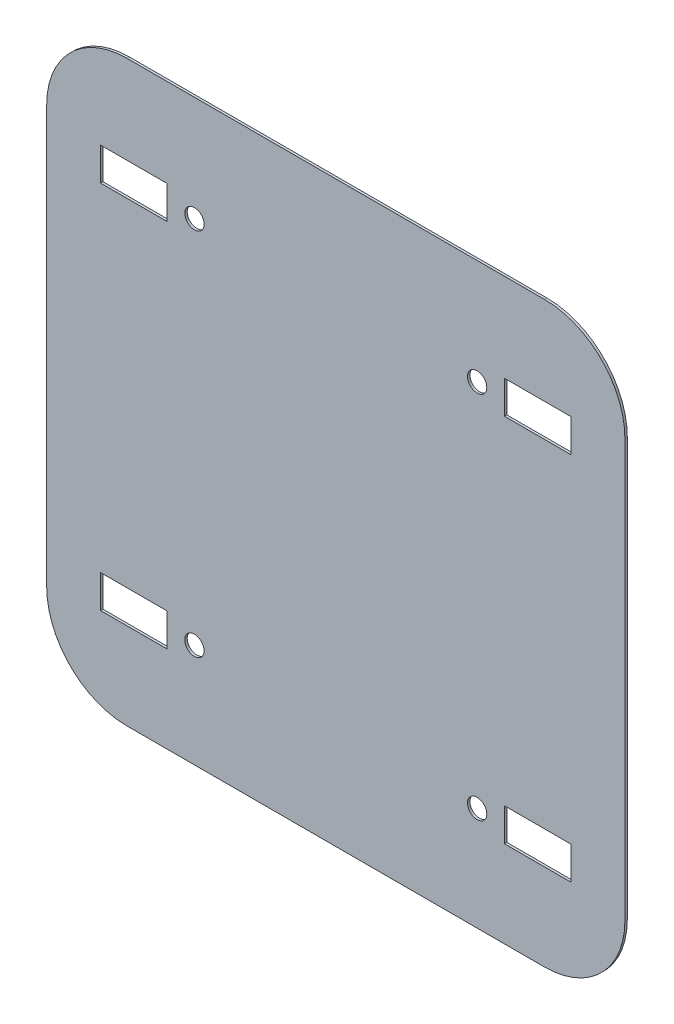
ISO-10303-21;
HEADER;
FILE_DESCRIPTION(('STEP AP214'),'2;1');
FILE_NAME('part.step','',(''),(''),'','','');
FILE_SCHEMA(('AUTOMOTIVE_DESIGN { 1 0 10303 214 1 1 1 1 }'));
ENDSEC;
DATA;
#1=APPLICATION_CONTEXT('core data for automotive mechanical design processes');
#2=APPLICATION_PROTOCOL_DEFINITION('international standard','automotive_design',2000,#1);
#3=PRODUCT_CONTEXT('',#1,'mechanical');
#4=PRODUCT('Part','Part','',(#3));
#5=PRODUCT_RELATED_PRODUCT_CATEGORY('part','',(#4));
#6=PRODUCT_DEFINITION_FORMATION('','',#4);
#7=PRODUCT_DEFINITION_CONTEXT('part definition',#1,'design');
#8=PRODUCT_DEFINITION('design','',#6,#7);
#9=PRODUCT_DEFINITION_SHAPE('','',#8);
#10=(LENGTH_UNIT() NAMED_UNIT(*) SI_UNIT(.MILLI.,.METRE.));
#11=(NAMED_UNIT(*) PLANE_ANGLE_UNIT() SI_UNIT($,.RADIAN.));
#12=(NAMED_UNIT(*) SI_UNIT($,.STERADIAN.) SOLID_ANGLE_UNIT());
#13=UNCERTAINTY_MEASURE_WITH_UNIT(LENGTH_MEASURE(1.E-05),#10,'distance_accuracy_value','');
#14=(GEOMETRIC_REPRESENTATION_CONTEXT(3) GLOBAL_UNCERTAINTY_ASSIGNED_CONTEXT((#13)) GLOBAL_UNIT_ASSIGNED_CONTEXT((#10,
#11,#12)) REPRESENTATION_CONTEXT('',''));
#15=CARTESIAN_POINT('',(0.,0.,0.));
#16=DIRECTION('',(0.,0.,1.));
#17=DIRECTION('',(1.,0.,0.));
#18=AXIS2_PLACEMENT_3D('',#15,#16,#17);
#19=CARTESIAN_POINT('',(50.,50.,1.5));
#20=DIRECTION('',(0.,0.,-1.));
#21=DIRECTION('',(-1.,0.,0.));
#22=AXIS2_PLACEMENT_3D('',#19,#20,#21);
#23=CYLINDRICAL_SURFACE('',#22,50.);
#24=CARTESIAN_POINT('',(50.,50.,0.));
#25=DIRECTION('',(0.,0.,1.));
#26=DIRECTION('',(1.,0.,0.));
#27=AXIS2_PLACEMENT_3D('',#24,#25,#26);
#28=CIRCLE('',#27,50.);
#29=CARTESIAN_POINT('',(0.,50.0000000000003,0.));
#30=VERTEX_POINT('',#29);
#31=CARTESIAN_POINT('',(50.0000000000003,0.,0.));
#32=VERTEX_POINT('',#31);
#33=EDGE_CURVE('E326',#30,#32,#28,.T.);
#34=ORIENTED_EDGE('',*,*,#33,.T.);
#35=DIRECTION('',(0.,0.,-1.));
#36=VECTOR('',#35,1.);
#37=CARTESIAN_POINT('',(50.0000000000003,0.,1.5));
#38=LINE('',#37,#36);
#39=CARTESIAN_POINT('',(50.0000000000003,0.,1.5));
#40=VERTEX_POINT('',#39);
#41=EDGE_CURVE('E11',#40,#32,#38,.T.);
#42=ORIENTED_EDGE('',*,*,#41,.F.);
#43=CARTESIAN_POINT('',(50.,50.,1.5));
#44=DIRECTION('',(0.,0.,1.));
#45=DIRECTION('',(1.,0.,0.));
#46=AXIS2_PLACEMENT_3D('',#43,#44,#45);
#47=CIRCLE('',#46,50.);
#48=CARTESIAN_POINT('',(0.,50.0000000000003,1.5));
#49=VERTEX_POINT('',#48);
#50=EDGE_CURVE('E333',#49,#40,#47,.T.);
#51=ORIENTED_EDGE('',*,*,#50,.F.);
#52=DIRECTION('',(0.,0.,-1.));
#53=VECTOR('',#52,1.);
#54=CARTESIAN_POINT('',(0.,50.0000000000003,1.5));
#55=LINE('',#54,#53);
#56=EDGE_CURVE('E351',#49,#30,#55,.T.);
#57=ORIENTED_EDGE('',*,*,#56,.T.);
#58=EDGE_LOOP('',(#34,#42,#51,#57));
#59=FACE_BOUND('',#58,.T.);
#60=ADVANCED_FACE('F34',(#59),#23,.T.);
#61=CARTESIAN_POINT('',(50.0000000000003,0.,1.5));
#62=DIRECTION('',(0.,1.,0.));
#63=DIRECTION('',(0.,0.,1.));
#64=AXIS2_PLACEMENT_3D('',#61,#62,#63);
#65=PLANE('',#64);
#66=DIRECTION('',(1.,0.,0.));
#67=VECTOR('',#66,1.);
#68=CARTESIAN_POINT('',(50.0000000000003,0.,0.));
#69=LINE('',#68,#67);
#70=CARTESIAN_POINT('',(310.,0.,0.));
#71=VERTEX_POINT('',#70);
#72=EDGE_CURVE('E354',#32,#71,#69,.T.);
#73=ORIENTED_EDGE('',*,*,#72,.T.);
#74=DIRECTION('',(0.,0.,-1.));
#75=VECTOR('',#74,1.);
#76=CARTESIAN_POINT('',(310.,0.,1.5));
#77=LINE('',#76,#75);
#78=CARTESIAN_POINT('',(310.,0.,1.5));
#79=VERTEX_POINT('',#78);
#80=EDGE_CURVE('E41',#79,#71,#77,.T.);
#81=ORIENTED_EDGE('',*,*,#80,.F.);
#82=DIRECTION('',(1.,0.,0.));
#83=VECTOR('',#82,1.);
#84=CARTESIAN_POINT('',(50.0000000000003,0.,1.5));
#85=LINE('',#84,#83);
#86=EDGE_CURVE('E336',#40,#79,#85,.T.);
#87=ORIENTED_EDGE('',*,*,#86,.F.);
#88=ORIENTED_EDGE('',*,*,#41,.T.);
#89=EDGE_LOOP('',(#73,#81,#87,#88));
#90=FACE_BOUND('',#89,.T.);
#91=ADVANCED_FACE('F410',(#90),#65,.F.);
#92=CARTESIAN_POINT('',(310.,50.,1.5));
#93=DIRECTION('',(0.,0.,-1.));
#94=DIRECTION('',(-1.,0.,0.));
#95=AXIS2_PLACEMENT_3D('',#92,#93,#94);
#96=CYLINDRICAL_SURFACE('',#95,50.);
#97=CARTESIAN_POINT('',(310.,50.,0.));
#98=DIRECTION('',(0.,0.,1.));
#99=DIRECTION('',(-1.,0.,0.));
#100=AXIS2_PLACEMENT_3D('',#97,#98,#99);
#101=CIRCLE('',#100,50.);
#102=CARTESIAN_POINT('',(360.,50.0000000000003,0.));
#103=VERTEX_POINT('',#102);
#104=EDGE_CURVE('E356',#71,#103,#101,.T.);
#105=ORIENTED_EDGE('',*,*,#104,.T.);
#106=DIRECTION('',(0.,0.,-1.));
#107=VECTOR('',#106,1.);
#108=CARTESIAN_POINT('',(360.,50.0000000000003,1.5));
#109=LINE('',#108,#107);
#110=CARTESIAN_POINT('',(360.,50.0000000000003,1.5));
#111=VERTEX_POINT('',#110);
#112=EDGE_CURVE('E381',#111,#103,#109,.T.);
#113=ORIENTED_EDGE('',*,*,#112,.F.);
#114=CARTESIAN_POINT('',(310.,50.,1.5));
#115=DIRECTION('',(0.,0.,1.));
#116=DIRECTION('',(-1.,0.,0.));
#117=AXIS2_PLACEMENT_3D('',#114,#115,#116);
#118=CIRCLE('',#117,50.);
#119=EDGE_CURVE('E339',#79,#111,#118,.T.);
#120=ORIENTED_EDGE('',*,*,#119,.F.);
#121=ORIENTED_EDGE('',*,*,#80,.T.);
#122=EDGE_LOOP('',(#105,#113,#120,#121));
#123=FACE_BOUND('',#122,.T.);
#124=ADVANCED_FACE('F388',(#123),#96,.T.);
#125=CARTESIAN_POINT('',(360.,50.0000000000003,1.5));
#126=DIRECTION('',(-1.,0.,0.));
#127=DIRECTION('',(0.,0.,1.));
#128=AXIS2_PLACEMENT_3D('',#125,#126,#127);
#129=PLANE('',#128);
#130=DIRECTION('',(0.,1.,0.));
#131=VECTOR('',#130,1.);
#132=CARTESIAN_POINT('',(360.,50.0000000000003,0.));
#133=LINE('',#132,#131);
#134=CARTESIAN_POINT('',(360.,310.,0.));
#135=VERTEX_POINT('',#134);
#136=EDGE_CURVE('E358',#103,#135,#133,.T.);
#137=ORIENTED_EDGE('',*,*,#136,.T.);
#138=DIRECTION('',(0.,0.,-1.));
#139=VECTOR('',#138,1.);
#140=CARTESIAN_POINT('',(360.,310.,1.5));
#141=LINE('',#140,#139);
#142=CARTESIAN_POINT('',(360.,310.,1.5));
#143=VERTEX_POINT('',#142);
#144=EDGE_CURVE('E378',#143,#135,#141,.T.);
#145=ORIENTED_EDGE('',*,*,#144,.F.);
#146=DIRECTION('',(0.,1.,0.));
#147=VECTOR('',#146,1.);
#148=CARTESIAN_POINT('',(360.,50.0000000000003,1.5));
#149=LINE('',#148,#147);
#150=EDGE_CURVE('E341',#111,#143,#149,.T.);
#151=ORIENTED_EDGE('',*,*,#150,.F.);
#152=ORIENTED_EDGE('',*,*,#112,.T.);
#153=EDGE_LOOP('',(#137,#145,#151,#152));
#154=FACE_BOUND('',#153,.T.);
#155=ADVANCED_FACE('F398',(#154),#129,.F.);
#156=CARTESIAN_POINT('',(310.,310.,1.5));
#157=DIRECTION('',(0.,0.,-1.));
#158=DIRECTION('',(-1.,0.,0.));
#159=AXIS2_PLACEMENT_3D('',#156,#157,#158);
#160=CYLINDRICAL_SURFACE('',#159,50.);
#161=CARTESIAN_POINT('',(310.,310.,0.));
#162=DIRECTION('',(0.,0.,1.));
#163=DIRECTION('',(-1.,0.,0.));
#164=AXIS2_PLACEMENT_3D('',#161,#162,#163);
#165=CIRCLE('',#164,50.);
#166=CARTESIAN_POINT('',(310.,360.,0.));
#167=VERTEX_POINT('',#166);
#168=EDGE_CURVE('E360',#135,#167,#165,.T.);
#169=ORIENTED_EDGE('',*,*,#168,.T.);
#170=DIRECTION('',(0.,0.,-1.));
#171=VECTOR('',#170,1.);
#172=CARTESIAN_POINT('',(310.,360.,1.5));
#173=LINE('',#172,#171);
#174=CARTESIAN_POINT('',(310.,360.,1.5));
#175=VERTEX_POINT('',#174);
#176=EDGE_CURVE('E375',#175,#167,#173,.T.);
#177=ORIENTED_EDGE('',*,*,#176,.F.);
#178=CARTESIAN_POINT('',(310.,310.,1.5));
#179=DIRECTION('',(0.,0.,1.));
#180=DIRECTION('',(-1.,0.,0.));
#181=AXIS2_PLACEMENT_3D('',#178,#179,#180);
#182=CIRCLE('',#181,50.);
#183=EDGE_CURVE('E343',#143,#175,#182,.T.);
#184=ORIENTED_EDGE('',*,*,#183,.F.);
#185=ORIENTED_EDGE('',*,*,#144,.T.);
#186=EDGE_LOOP('',(#169,#177,#184,#185));
#187=FACE_BOUND('',#186,.T.);
#188=ADVANCED_FACE('F402',(#187),#160,.T.);
#189=CARTESIAN_POINT('',(50.0000000000004,360.,1.5));
#190=DIRECTION('',(0.,-1.,0.));
#191=DIRECTION('',(0.,0.,-1.));
#192=AXIS2_PLACEMENT_3D('',#189,#190,#191);
#193=PLANE('',#192);
#194=DIRECTION('',(-1.,0.,0.));
#195=VECTOR('',#194,1.);
#196=CARTESIAN_POINT('',(50.0000000000004,360.,0.));
#197=LINE('',#196,#195);
#198=CARTESIAN_POINT('',(50.0000000000004,360.,0.));
#199=VERTEX_POINT('',#198);
#200=EDGE_CURVE('E362',#167,#199,#197,.T.);
#201=ORIENTED_EDGE('',*,*,#200,.T.);
#202=DIRECTION('',(0.,0.,-1.));
#203=VECTOR('',#202,1.);
#204=CARTESIAN_POINT('',(50.0000000000004,360.,1.5));
#205=LINE('',#204,#203);
#206=CARTESIAN_POINT('',(50.0000000000004,360.,1.5));
#207=VERTEX_POINT('',#206);
#208=EDGE_CURVE('E372',#207,#199,#205,.T.);
#209=ORIENTED_EDGE('',*,*,#208,.F.);
#210=DIRECTION('',(-1.,0.,0.));
#211=VECTOR('',#210,1.);
#212=CARTESIAN_POINT('',(50.0000000000004,360.,1.5));
#213=LINE('',#212,#211);
#214=EDGE_CURVE('E345',#175,#207,#213,.T.);
#215=ORIENTED_EDGE('',*,*,#214,.F.);
#216=ORIENTED_EDGE('',*,*,#176,.T.);
#217=EDGE_LOOP('',(#201,#209,#215,#216));
#218=FACE_BOUND('',#217,.T.);
#219=ADVANCED_FACE('F423',(#218),#193,.F.);
#220=CARTESIAN_POINT('',(50.,310.,1.5));
#221=DIRECTION('',(0.,0.,-1.));
#222=DIRECTION('',(-1.,0.,0.));
#223=AXIS2_PLACEMENT_3D('',#220,#221,#222);
#224=CYLINDRICAL_SURFACE('',#223,50.);
#225=CARTESIAN_POINT('',(50.,310.,0.));
#226=DIRECTION('',(0.,0.,1.));
#227=DIRECTION('',(1.,0.,0.));
#228=AXIS2_PLACEMENT_3D('',#225,#226,#227);
#229=CIRCLE('',#228,50.);
#230=CARTESIAN_POINT('',(0.,310.,0.));
#231=VERTEX_POINT('',#230);
#232=EDGE_CURVE('E364',#199,#231,#229,.T.);
#233=ORIENTED_EDGE('',*,*,#232,.T.);
#234=DIRECTION('',(0.,0.,-1.));
#235=VECTOR('',#234,1.);
#236=CARTESIAN_POINT('',(0.,310.,1.5));
#237=LINE('',#236,#235);
#238=CARTESIAN_POINT('',(0.,310.,1.5));
#239=VERTEX_POINT('',#238);
#240=EDGE_CURVE('E369',#239,#231,#237,.T.);
#241=ORIENTED_EDGE('',*,*,#240,.F.);
#242=CARTESIAN_POINT('',(50.,310.,1.5));
#243=DIRECTION('',(0.,0.,1.));
#244=DIRECTION('',(1.,0.,0.));
#245=AXIS2_PLACEMENT_3D('',#242,#243,#244);
#246=CIRCLE('',#245,50.);
#247=EDGE_CURVE('E347',#207,#239,#246,.T.);
#248=ORIENTED_EDGE('',*,*,#247,.F.);
#249=ORIENTED_EDGE('',*,*,#208,.T.);
#250=EDGE_LOOP('',(#233,#241,#248,#249));
#251=FACE_BOUND('',#250,.T.);
#252=ADVANCED_FACE('F421',(#251),#224,.T.);
#253=CARTESIAN_POINT('',(0.,50.0000000000003,1.5));
#254=DIRECTION('',(1.,0.,0.));
#255=DIRECTION('',(0.,0.,-1.));
#256=AXIS2_PLACEMENT_3D('',#253,#254,#255);
#257=PLANE('',#256);
#258=DIRECTION('',(0.,-1.,0.));
#259=VECTOR('',#258,1.);
#260=CARTESIAN_POINT('',(0.,50.0000000000003,0.));
#261=LINE('',#260,#259);
#262=EDGE_CURVE('E337',#231,#30,#261,.T.);
#263=ORIENTED_EDGE('',*,*,#262,.T.);
#264=ORIENTED_EDGE('',*,*,#56,.F.);
#265=DIRECTION('',(0.,-1.,0.));
#266=VECTOR('',#265,1.);
#267=CARTESIAN_POINT('',(0.,50.0000000000003,1.5));
#268=LINE('',#267,#266);
#269=EDGE_CURVE('E349',#239,#49,#268,.T.);
#270=ORIENTED_EDGE('',*,*,#269,.F.);
#271=ORIENTED_EDGE('',*,*,#240,.T.);
#272=EDGE_LOOP('',(#263,#264,#270,#271));
#273=FACE_BOUND('',#272,.T.);
#274=ADVANCED_FACE('F416',(#273),#257,.F.);
#275=CARTESIAN_POINT('',(50.,50.,1.5));
#276=DIRECTION('',(0.,0.,1.));
#277=DIRECTION('',(1.,0.,0.));
#278=AXIS2_PLACEMENT_3D('',#275,#276,#277);
#279=PLANE('',#278);
#280=CARTESIAN_POINT('',(92.,294.5,1.5));
#281=DIRECTION('',(0.,0.,1.));
#282=DIRECTION('',(1.,0.,0.));
#283=AXIS2_PLACEMENT_3D('',#280,#281,#282);
#284=CIRCLE('',#283,5.99999999999999);
#285=CARTESIAN_POINT('',(98.,294.5,1.5));
#286=VERTEX_POINT('',#285);
#287=EDGE_CURVE('E690',#286,#286,#284,.T.);
#288=ORIENTED_EDGE('',*,*,#287,.F.);
#289=EDGE_LOOP('',(#288));
#290=FACE_BOUND('',#289,.T.);
#291=CARTESIAN_POINT('',(268.,294.5,1.5));
#292=DIRECTION('',(0.,0.,1.));
#293=DIRECTION('',(1.,0.,0.));
#294=AXIS2_PLACEMENT_3D('',#291,#292,#293);
#295=CIRCLE('',#294,6.00000000000001);
#296=CARTESIAN_POINT('',(274.,294.5,1.5));
#297=VERTEX_POINT('',#296);
#298=EDGE_CURVE('E692',#297,#297,#295,.T.);
#299=ORIENTED_EDGE('',*,*,#298,.F.);
#300=EDGE_LOOP('',(#299));
#301=FACE_BOUND('',#300,.T.);
#302=CARTESIAN_POINT('',(268.,64.5,1.5));
#303=DIRECTION('',(0.,0.,1.));
#304=DIRECTION('',(1.,0.,0.));
#305=AXIS2_PLACEMENT_3D('',#302,#303,#304);
#306=CIRCLE('',#305,6.00000000000001);
#307=CARTESIAN_POINT('',(274.,64.5,1.5));
#308=VERTEX_POINT('',#307);
#309=EDGE_CURVE('E700',#308,#308,#306,.T.);
#310=ORIENTED_EDGE('',*,*,#309,.F.);
#311=EDGE_LOOP('',(#310));
#312=FACE_BOUND('',#311,.T.);
#313=CARTESIAN_POINT('',(92.,64.5,1.5));
#314=DIRECTION('',(0.,0.,1.));
#315=DIRECTION('',(1.,0.,0.));
#316=AXIS2_PLACEMENT_3D('',#313,#314,#315);
#317=CIRCLE('',#316,5.99999999999999);
#318=CARTESIAN_POINT('',(98.,64.5,1.5));
#319=VERTEX_POINT('',#318);
#320=EDGE_CURVE('E705',#319,#319,#317,.T.);
#321=ORIENTED_EDGE('',*,*,#320,.F.);
#322=EDGE_LOOP('',(#321));
#323=FACE_BOUND('',#322,.T.);
#324=DIRECTION('',(-1.,0.,0.));
#325=VECTOR('',#324,1.);
#326=CARTESIAN_POINT('',(33.5,74.5,1.5));
#327=LINE('',#326,#325);
#328=CARTESIAN_POINT('',(75.,74.5,1.5));
#329=VERTEX_POINT('',#328);
#330=CARTESIAN_POINT('',(33.5,74.5,1.5));
#331=VERTEX_POINT('',#330);
#332=EDGE_CURVE('E48',#329,#331,#327,.T.);
#333=ORIENTED_EDGE('',*,*,#332,.F.);
#334=DIRECTION('',(0.,1.,0.));
#335=VECTOR('',#334,1.);
#336=CARTESIAN_POINT('',(75.,74.5,1.5));
#337=LINE('',#336,#335);
#338=CARTESIAN_POINT('',(75.,54.,1.5));
#339=VERTEX_POINT('',#338);
#340=EDGE_CURVE('E276',#339,#329,#337,.T.);
#341=ORIENTED_EDGE('',*,*,#340,.F.);
#342=DIRECTION('',(1.,0.,0.));
#343=VECTOR('',#342,1.);
#344=CARTESIAN_POINT('',(33.5,54.,1.5));
#345=LINE('',#344,#343);
#346=CARTESIAN_POINT('',(33.5,54.,1.5));
#347=VERTEX_POINT('',#346);
#348=EDGE_CURVE('E290',#347,#339,#345,.T.);
#349=ORIENTED_EDGE('',*,*,#348,.F.);
#350=DIRECTION('',(0.,-1.,0.));
#351=VECTOR('',#350,1.);
#352=CARTESIAN_POINT('',(33.5,74.5,1.5));
#353=LINE('',#352,#351);
#354=EDGE_CURVE('E287',#331,#347,#353,.T.);
#355=ORIENTED_EDGE('',*,*,#354,.F.);
#356=EDGE_LOOP('',(#333,#341,#349,#355));
#357=FACE_BOUND('',#356,.T.);
#358=DIRECTION('',(-1.,0.,0.));
#359=VECTOR('',#358,1.);
#360=CARTESIAN_POINT('',(285.,74.5,1.5));
#361=LINE('',#360,#359);
#362=CARTESIAN_POINT('',(326.5,74.5,1.5));
#363=VERTEX_POINT('',#362);
#364=CARTESIAN_POINT('',(285.,74.5,1.5));
#365=VERTEX_POINT('',#364);
#366=EDGE_CURVE('E56',#363,#365,#361,.T.);
#367=ORIENTED_EDGE('',*,*,#366,.F.);
#368=DIRECTION('',(0.,1.,0.));
#369=VECTOR('',#368,1.);
#370=CARTESIAN_POINT('',(326.5,74.5,1.5));
#371=LINE('',#370,#369);
#372=CARTESIAN_POINT('',(326.5,54.,1.5));
#373=VERTEX_POINT('',#372);
#374=EDGE_CURVE('E246',#373,#363,#371,.T.);
#375=ORIENTED_EDGE('',*,*,#374,.F.);
#376=DIRECTION('',(1.,0.,0.));
#377=VECTOR('',#376,1.);
#378=CARTESIAN_POINT('',(285.,54.,1.5));
#379=LINE('',#378,#377);
#380=CARTESIAN_POINT('',(285.,54.,1.5));
#381=VERTEX_POINT('',#380);
#382=EDGE_CURVE('E261',#381,#373,#379,.T.);
#383=ORIENTED_EDGE('',*,*,#382,.F.);
#384=DIRECTION('',(0.,-1.,0.));
#385=VECTOR('',#384,1.);
#386=CARTESIAN_POINT('',(285.,74.5,1.5));
#387=LINE('',#386,#385);
#388=EDGE_CURVE('E257',#365,#381,#387,.T.);
#389=ORIENTED_EDGE('',*,*,#388,.F.);
#390=EDGE_LOOP('',(#367,#375,#383,#389));
#391=FACE_BOUND('',#390,.T.);
#392=DIRECTION('',(-1.,0.,0.));
#393=VECTOR('',#392,1.);
#394=CARTESIAN_POINT('',(285.,305.,1.5));
#395=LINE('',#394,#393);
#396=CARTESIAN_POINT('',(326.5,305.,1.5));
#397=VERTEX_POINT('',#396);
#398=CARTESIAN_POINT('',(285.,305.,1.5));
#399=VERTEX_POINT('',#398);
#400=EDGE_CURVE('E201',#397,#399,#395,.T.);
#401=ORIENTED_EDGE('',*,*,#400,.F.);
#402=DIRECTION('',(0.,1.,0.));
#403=VECTOR('',#402,1.);
#404=CARTESIAN_POINT('',(326.5,305.,1.5));
#405=LINE('',#404,#403);
#406=CARTESIAN_POINT('',(326.5,284.5,1.5));
#407=VERTEX_POINT('',#406);
#408=EDGE_CURVE('E219',#407,#397,#405,.T.);
#409=ORIENTED_EDGE('',*,*,#408,.F.);
#410=DIRECTION('',(1.,0.,0.));
#411=VECTOR('',#410,1.);
#412=CARTESIAN_POINT('',(285.,284.5,1.5));
#413=LINE('',#412,#411);
#414=CARTESIAN_POINT('',(285.,284.5,1.5));
#415=VERTEX_POINT('',#414);
#416=EDGE_CURVE('E222',#415,#407,#413,.T.);
#417=ORIENTED_EDGE('',*,*,#416,.F.);
#418=DIRECTION('',(0.,-1.,0.));
#419=VECTOR('',#418,1.);
#420=CARTESIAN_POINT('',(285.,305.,1.5));
#421=LINE('',#420,#419);
#422=EDGE_CURVE('E231',#399,#415,#421,.T.);
#423=ORIENTED_EDGE('',*,*,#422,.F.);
#424=EDGE_LOOP('',(#401,#409,#417,#423));
#425=FACE_BOUND('',#424,.T.);
#426=DIRECTION('',(0.,-1.,0.));
#427=VECTOR('',#426,1.);
#428=CARTESIAN_POINT('',(33.5,305.,1.5));
#429=LINE('',#428,#427);
#430=CARTESIAN_POINT('',(33.5,305.,1.5));
#431=VERTEX_POINT('',#430);
#432=CARTESIAN_POINT('',(33.5,284.5,1.5));
#433=VERTEX_POINT('',#432);
#434=EDGE_CURVE('E238',#431,#433,#429,.T.);
#435=ORIENTED_EDGE('',*,*,#434,.F.);
#436=DIRECTION('',(-1.,0.,0.));
#437=VECTOR('',#436,1.);
#438=CARTESIAN_POINT('',(33.5,305.,1.5));
#439=LINE('',#438,#437);
#440=CARTESIAN_POINT('',(75.,305.,1.5));
#441=VERTEX_POINT('',#440);
#442=EDGE_CURVE('E305',#441,#431,#439,.T.);
#443=ORIENTED_EDGE('',*,*,#442,.F.);
#444=DIRECTION('',(0.,1.,0.));
#445=VECTOR('',#444,1.);
#446=CARTESIAN_POINT('',(75.,305.,1.5));
#447=LINE('',#446,#445);
#448=CARTESIAN_POINT('',(75.,284.5,1.5));
#449=VERTEX_POINT('',#448);
#450=EDGE_CURVE('E319',#449,#441,#447,.T.);
#451=ORIENTED_EDGE('',*,*,#450,.F.);
#452=DIRECTION('',(1.,0.,0.));
#453=VECTOR('',#452,1.);
#454=CARTESIAN_POINT('',(33.5,284.5,1.5));
#455=LINE('',#454,#453);
#456=EDGE_CURVE('E316',#433,#449,#455,.T.);
#457=ORIENTED_EDGE('',*,*,#456,.F.);
#458=EDGE_LOOP('',(#435,#443,#451,#457));
#459=FACE_BOUND('',#458,.T.);
#460=ORIENTED_EDGE('',*,*,#50,.T.);
#461=ORIENTED_EDGE('',*,*,#86,.T.);
#462=ORIENTED_EDGE('',*,*,#119,.T.);
#463=ORIENTED_EDGE('',*,*,#150,.T.);
#464=ORIENTED_EDGE('',*,*,#183,.T.);
#465=ORIENTED_EDGE('',*,*,#214,.T.);
#466=ORIENTED_EDGE('',*,*,#247,.T.);
#467=ORIENTED_EDGE('',*,*,#269,.T.);
#468=EDGE_LOOP('',(#460,#461,#462,#463,#464,#465,#466,#467));
#469=FACE_BOUND('',#468,.T.);
#470=ADVANCED_FACE('F406',(#290,#301,#312,#323,#357,#391,#425,#459,#469),#279,.T.);
#471=CARTESIAN_POINT('',(50.,50.,0.));
#472=DIRECTION('',(0.,0.,1.));
#473=DIRECTION('',(1.,0.,0.));
#474=AXIS2_PLACEMENT_3D('',#471,#472,#473);
#475=PLANE('',#474);
#476=CARTESIAN_POINT('',(92.,294.5,0.));
#477=DIRECTION('',(0.,0.,1.));
#478=DIRECTION('',(1.,0.,0.));
#479=AXIS2_PLACEMENT_3D('',#476,#477,#478);
#480=CIRCLE('',#479,6.00000000000001);
#481=CARTESIAN_POINT('',(98.,294.5,0.));
#482=VERTEX_POINT('',#481);
#483=EDGE_CURVE('E687',#482,#482,#480,.T.);
#484=ORIENTED_EDGE('',*,*,#483,.T.);
#485=EDGE_LOOP('',(#484));
#486=FACE_BOUND('',#485,.T.);
#487=CARTESIAN_POINT('',(268.,294.5,0.));
#488=DIRECTION('',(0.,0.,1.));
#489=DIRECTION('',(1.,0.,0.));
#490=AXIS2_PLACEMENT_3D('',#487,#488,#489);
#491=CIRCLE('',#490,6.00000000000001);
#492=CARTESIAN_POINT('',(274.,294.5,0.));
#493=VERTEX_POINT('',#492);
#494=EDGE_CURVE('E697',#493,#493,#491,.T.);
#495=ORIENTED_EDGE('',*,*,#494,.T.);
#496=EDGE_LOOP('',(#495));
#497=FACE_BOUND('',#496,.T.);
#498=CARTESIAN_POINT('',(268.,64.5,0.));
#499=DIRECTION('',(0.,0.,1.));
#500=DIRECTION('',(1.,0.,0.));
#501=AXIS2_PLACEMENT_3D('',#498,#499,#500);
#502=CIRCLE('',#501,6.00000000000001);
#503=CARTESIAN_POINT('',(274.,64.5,0.));
#504=VERTEX_POINT('',#503);
#505=EDGE_CURVE('E703',#504,#504,#502,.T.);
#506=ORIENTED_EDGE('',*,*,#505,.T.);
#507=EDGE_LOOP('',(#506));
#508=FACE_BOUND('',#507,.T.);
#509=CARTESIAN_POINT('',(92.,64.5,0.));
#510=DIRECTION('',(0.,0.,1.));
#511=DIRECTION('',(1.,0.,0.));
#512=AXIS2_PLACEMENT_3D('',#509,#510,#511);
#513=CIRCLE('',#512,6.00000000000001);
#514=CARTESIAN_POINT('',(98.,64.5,0.));
#515=VERTEX_POINT('',#514);
#516=EDGE_CURVE('E225',#515,#515,#513,.T.);
#517=ORIENTED_EDGE('',*,*,#516,.T.);
#518=EDGE_LOOP('',(#517));
#519=FACE_BOUND('',#518,.T.);
#520=DIRECTION('',(0.,1.,0.));
#521=VECTOR('',#520,1.);
#522=CARTESIAN_POINT('',(75.,74.5,0.));
#523=LINE('',#522,#521);
#524=CARTESIAN_POINT('',(75.,54.,0.));
#525=VERTEX_POINT('',#524);
#526=CARTESIAN_POINT('',(75.,74.5,0.));
#527=VERTEX_POINT('',#526);
#528=EDGE_CURVE('E282',#525,#527,#523,.T.);
#529=ORIENTED_EDGE('',*,*,#528,.T.);
#530=DIRECTION('',(-1.,0.,0.));
#531=VECTOR('',#530,1.);
#532=CARTESIAN_POINT('',(33.5,74.5,0.));
#533=LINE('',#532,#531);
#534=CARTESIAN_POINT('',(33.5,74.5,0.));
#535=VERTEX_POINT('',#534);
#536=EDGE_CURVE('E272',#527,#535,#533,.T.);
#537=ORIENTED_EDGE('',*,*,#536,.T.);
#538=DIRECTION('',(0.,-1.,0.));
#539=VECTOR('',#538,1.);
#540=CARTESIAN_POINT('',(33.5,74.5,0.));
#541=LINE('',#540,#539);
#542=CARTESIAN_POINT('',(33.5,54.,0.));
#543=VERTEX_POINT('',#542);
#544=EDGE_CURVE('E275',#535,#543,#541,.T.);
#545=ORIENTED_EDGE('',*,*,#544,.T.);
#546=DIRECTION('',(1.,0.,0.));
#547=VECTOR('',#546,1.);
#548=CARTESIAN_POINT('',(33.5,54.,0.));
#549=LINE('',#548,#547);
#550=EDGE_CURVE('E279',#543,#525,#549,.T.);
#551=ORIENTED_EDGE('',*,*,#550,.T.);
#552=EDGE_LOOP('',(#529,#537,#545,#551));
#553=FACE_BOUND('',#552,.T.);
#554=DIRECTION('',(0.,1.,0.));
#555=VECTOR('',#554,1.);
#556=CARTESIAN_POINT('',(326.5,74.5,0.));
#557=LINE('',#556,#555);
#558=CARTESIAN_POINT('',(326.5,54.,0.));
#559=VERTEX_POINT('',#558);
#560=CARTESIAN_POINT('',(326.5,74.5,0.));
#561=VERTEX_POINT('',#560);
#562=EDGE_CURVE('E252',#559,#561,#557,.T.);
#563=ORIENTED_EDGE('',*,*,#562,.T.);
#564=DIRECTION('',(-1.,0.,0.));
#565=VECTOR('',#564,1.);
#566=CARTESIAN_POINT('',(285.,74.5,0.));
#567=LINE('',#566,#565);
#568=CARTESIAN_POINT('',(285.,74.5,0.));
#569=VERTEX_POINT('',#568);
#570=EDGE_CURVE('E242',#561,#569,#567,.T.);
#571=ORIENTED_EDGE('',*,*,#570,.T.);
#572=DIRECTION('',(0.,-1.,0.));
#573=VECTOR('',#572,1.);
#574=CARTESIAN_POINT('',(285.,74.5,0.));
#575=LINE('',#574,#573);
#576=CARTESIAN_POINT('',(285.,54.,0.));
#577=VERTEX_POINT('',#576);
#578=EDGE_CURVE('E245',#569,#577,#575,.T.);
#579=ORIENTED_EDGE('',*,*,#578,.T.);
#580=DIRECTION('',(1.,0.,0.));
#581=VECTOR('',#580,1.);
#582=CARTESIAN_POINT('',(285.,54.,0.));
#583=LINE('',#582,#581);
#584=EDGE_CURVE('E249',#577,#559,#583,.T.);
#585=ORIENTED_EDGE('',*,*,#584,.T.);
#586=EDGE_LOOP('',(#563,#571,#579,#585));
#587=FACE_BOUND('',#586,.T.);
#588=DIRECTION('',(0.,1.,0.));
#589=VECTOR('',#588,1.);
#590=CARTESIAN_POINT('',(326.5,305.,0.));
#591=LINE('',#590,#589);
#592=CARTESIAN_POINT('',(326.5,284.5,0.));
#593=VERTEX_POINT('',#592);
#594=CARTESIAN_POINT('',(326.5,305.,0.));
#595=VERTEX_POINT('',#594);
#596=EDGE_CURVE('E206',#593,#595,#591,.T.);
#597=ORIENTED_EDGE('',*,*,#596,.T.);
#598=DIRECTION('',(-1.,0.,0.));
#599=VECTOR('',#598,1.);
#600=CARTESIAN_POINT('',(285.,305.,0.));
#601=LINE('',#600,#599);
#602=CARTESIAN_POINT('',(285.,305.,0.));
#603=VERTEX_POINT('',#602);
#604=EDGE_CURVE('E198',#595,#603,#601,.T.);
#605=ORIENTED_EDGE('',*,*,#604,.T.);
#606=DIRECTION('',(0.,-1.,0.));
#607=VECTOR('',#606,1.);
#608=CARTESIAN_POINT('',(285.,305.,0.));
#609=LINE('',#608,#607);
#610=CARTESIAN_POINT('',(285.,284.5,0.));
#611=VERTEX_POINT('',#610);
#612=EDGE_CURVE('E210',#603,#611,#609,.T.);
#613=ORIENTED_EDGE('',*,*,#612,.T.);
#614=DIRECTION('',(1.,0.,0.));
#615=VECTOR('',#614,1.);
#616=CARTESIAN_POINT('',(285.,284.5,0.));
#617=LINE('',#616,#615);
#618=EDGE_CURVE('E214',#611,#593,#617,.T.);
#619=ORIENTED_EDGE('',*,*,#618,.T.);
#620=EDGE_LOOP('',(#597,#605,#613,#619));
#621=FACE_BOUND('',#620,.T.);
#622=DIRECTION('',(-1.,0.,0.));
#623=VECTOR('',#622,1.);
#624=CARTESIAN_POINT('',(33.5,305.,0.));
#625=LINE('',#624,#623);
#626=CARTESIAN_POINT('',(75.,305.,0.));
#627=VERTEX_POINT('',#626);
#628=CARTESIAN_POINT('',(33.5,305.,0.));
#629=VERTEX_POINT('',#628);
#630=EDGE_CURVE('E311',#627,#629,#625,.T.);
#631=ORIENTED_EDGE('',*,*,#630,.T.);
#632=DIRECTION('',(0.,-1.,0.));
#633=VECTOR('',#632,1.);
#634=CARTESIAN_POINT('',(33.5,305.,0.));
#635=LINE('',#634,#633);
#636=CARTESIAN_POINT('',(33.5,284.5,0.));
#637=VERTEX_POINT('',#636);
#638=EDGE_CURVE('E301',#629,#637,#635,.T.);
#639=ORIENTED_EDGE('',*,*,#638,.T.);
#640=DIRECTION('',(1.,0.,0.));
#641=VECTOR('',#640,1.);
#642=CARTESIAN_POINT('',(33.5,284.5,0.));
#643=LINE('',#642,#641);
#644=CARTESIAN_POINT('',(75.,284.5,0.));
#645=VERTEX_POINT('',#644);
#646=EDGE_CURVE('E304',#637,#645,#643,.T.);
#647=ORIENTED_EDGE('',*,*,#646,.T.);
#648=DIRECTION('',(0.,1.,0.));
#649=VECTOR('',#648,1.);
#650=CARTESIAN_POINT('',(75.,305.,0.));
#651=LINE('',#650,#649);
#652=EDGE_CURVE('E308',#645,#627,#651,.T.);
#653=ORIENTED_EDGE('',*,*,#652,.T.);
#654=EDGE_LOOP('',(#631,#639,#647,#653));
#655=FACE_BOUND('',#654,.T.);
#656=ORIENTED_EDGE('',*,*,#33,.F.);
#657=ORIENTED_EDGE('',*,*,#262,.F.);
#658=ORIENTED_EDGE('',*,*,#232,.F.);
#659=ORIENTED_EDGE('',*,*,#200,.F.);
#660=ORIENTED_EDGE('',*,*,#168,.F.);
#661=ORIENTED_EDGE('',*,*,#136,.F.);
#662=ORIENTED_EDGE('',*,*,#104,.F.);
#663=ORIENTED_EDGE('',*,*,#72,.F.);
#664=EDGE_LOOP('',(#656,#657,#658,#659,#660,#661,#662,#663));
#665=FACE_BOUND('',#664,.T.);
#666=ADVANCED_FACE('F216',(#486,#497,#508,#519,#553,#587,#621,#655,#665),#475,.F.);
#667=CARTESIAN_POINT('',(33.5,305.,0.));
#668=DIRECTION('',(-1.,0.,0.));
#669=DIRECTION('',(0.,0.,1.));
#670=AXIS2_PLACEMENT_3D('',#667,#668,#669);
#671=PLANE('',#670);
#672=ORIENTED_EDGE('',*,*,#434,.T.);
#673=DIRECTION('',(0.,0.,1.));
#674=VECTOR('',#673,1.);
#675=CARTESIAN_POINT('',(33.5,284.5,0.));
#676=LINE('',#675,#674);
#677=EDGE_CURVE('E314',#637,#433,#676,.T.);
#678=ORIENTED_EDGE('',*,*,#677,.F.);
#679=ORIENTED_EDGE('',*,*,#638,.F.);
#680=DIRECTION('',(0.,0.,1.));
#681=VECTOR('',#680,1.);
#682=CARTESIAN_POINT('',(33.5,305.,0.));
#683=LINE('',#682,#681);
#684=EDGE_CURVE('E324',#629,#431,#683,.T.);
#685=ORIENTED_EDGE('',*,*,#684,.T.);
#686=EDGE_LOOP('',(#672,#678,#679,#685));
#687=FACE_BOUND('',#686,.T.);
#688=ADVANCED_FACE('F475',(#687),#671,.F.);
#689=CARTESIAN_POINT('',(33.5,305.,0.));
#690=DIRECTION('',(0.,1.,0.));
#691=DIRECTION('',(0.,0.,1.));
#692=AXIS2_PLACEMENT_3D('',#689,#690,#691);
#693=PLANE('',#692);
#694=ORIENTED_EDGE('',*,*,#442,.T.);
#695=ORIENTED_EDGE('',*,*,#684,.F.);
#696=ORIENTED_EDGE('',*,*,#630,.F.);
#697=DIRECTION('',(0.,0.,1.));
#698=VECTOR('',#697,1.);
#699=CARTESIAN_POINT('',(75.,305.,0.));
#700=LINE('',#699,#698);
#701=EDGE_CURVE('E327',#627,#441,#700,.T.);
#702=ORIENTED_EDGE('',*,*,#701,.T.);
#703=EDGE_LOOP('',(#694,#695,#696,#702));
#704=FACE_BOUND('',#703,.T.);
#705=ADVANCED_FACE('F480',(#704),#693,.F.);
#706=CARTESIAN_POINT('',(75.,305.,0.));
#707=DIRECTION('',(1.,0.,0.));
#708=DIRECTION('',(0.,0.,-1.));
#709=AXIS2_PLACEMENT_3D('',#706,#707,#708);
#710=PLANE('',#709);
#711=ORIENTED_EDGE('',*,*,#450,.T.);
#712=ORIENTED_EDGE('',*,*,#701,.F.);
#713=ORIENTED_EDGE('',*,*,#652,.F.);
#714=DIRECTION('',(0.,0.,1.));
#715=VECTOR('',#714,1.);
#716=CARTESIAN_POINT('',(75.,284.5,0.));
#717=LINE('',#716,#715);
#718=EDGE_CURVE('E329',#645,#449,#717,.T.);
#719=ORIENTED_EDGE('',*,*,#718,.T.);
#720=EDGE_LOOP('',(#711,#712,#713,#719));
#721=FACE_BOUND('',#720,.T.);
#722=ADVANCED_FACE('F492',(#721),#710,.F.);
#723=CARTESIAN_POINT('',(33.5,284.5,0.));
#724=DIRECTION('',(0.,-1.,0.));
#725=DIRECTION('',(0.,0.,-1.));
#726=AXIS2_PLACEMENT_3D('',#723,#724,#725);
#727=PLANE('',#726);
#728=ORIENTED_EDGE('',*,*,#456,.T.);
#729=ORIENTED_EDGE('',*,*,#718,.F.);
#730=ORIENTED_EDGE('',*,*,#646,.F.);
#731=ORIENTED_EDGE('',*,*,#677,.T.);
#732=EDGE_LOOP('',(#728,#729,#730,#731));
#733=FACE_BOUND('',#732,.T.);
#734=ADVANCED_FACE('F502',(#733),#727,.F.);
#735=CARTESIAN_POINT('',(285.,305.,0.));
#736=DIRECTION('',(0.,1.,0.));
#737=DIRECTION('',(0.,0.,1.));
#738=AXIS2_PLACEMENT_3D('',#735,#736,#737);
#739=PLANE('',#738);
#740=ORIENTED_EDGE('',*,*,#400,.T.);
#741=DIRECTION('',(0.,0.,1.));
#742=VECTOR('',#741,1.);
#743=CARTESIAN_POINT('',(285.,305.,0.));
#744=LINE('',#743,#742);
#745=EDGE_CURVE('E194',#603,#399,#744,.T.);
#746=ORIENTED_EDGE('',*,*,#745,.F.);
#747=ORIENTED_EDGE('',*,*,#604,.F.);
#748=DIRECTION('',(0.,0.,1.));
#749=VECTOR('',#748,1.);
#750=CARTESIAN_POINT('',(326.5,305.,0.));
#751=LINE('',#750,#749);
#752=EDGE_CURVE('E236',#595,#397,#751,.T.);
#753=ORIENTED_EDGE('',*,*,#752,.T.);
#754=EDGE_LOOP('',(#740,#746,#747,#753));
#755=FACE_BOUND('',#754,.T.);
#756=ADVANCED_FACE('F196',(#755),#739,.F.);
#757=CARTESIAN_POINT('',(326.5,305.,0.));
#758=DIRECTION('',(1.,0.,0.));
#759=DIRECTION('',(0.,0.,-1.));
#760=AXIS2_PLACEMENT_3D('',#757,#758,#759);
#761=PLANE('',#760);
#762=ORIENTED_EDGE('',*,*,#408,.T.);
#763=ORIENTED_EDGE('',*,*,#752,.F.);
#764=ORIENTED_EDGE('',*,*,#596,.F.);
#765=DIRECTION('',(0.,0.,1.));
#766=VECTOR('',#765,1.);
#767=CARTESIAN_POINT('',(326.5,284.5,0.));
#768=LINE('',#767,#766);
#769=EDGE_CURVE('E239',#593,#407,#768,.T.);
#770=ORIENTED_EDGE('',*,*,#769,.T.);
#771=EDGE_LOOP('',(#762,#763,#764,#770));
#772=FACE_BOUND('',#771,.T.);
#773=ADVANCED_FACE('F521',(#772),#761,.F.);
#774=CARTESIAN_POINT('',(285.,284.5,0.));
#775=DIRECTION('',(0.,-1.,0.));
#776=DIRECTION('',(0.,0.,-1.));
#777=AXIS2_PLACEMENT_3D('',#774,#775,#776);
#778=PLANE('',#777);
#779=ORIENTED_EDGE('',*,*,#416,.T.);
#780=ORIENTED_EDGE('',*,*,#769,.F.);
#781=ORIENTED_EDGE('',*,*,#618,.F.);
#782=DIRECTION('',(0.,0.,1.));
#783=VECTOR('',#782,1.);
#784=CARTESIAN_POINT('',(285.,284.5,0.));
#785=LINE('',#784,#783);
#786=EDGE_CURVE('E205',#611,#415,#785,.T.);
#787=ORIENTED_EDGE('',*,*,#786,.T.);
#788=EDGE_LOOP('',(#779,#780,#781,#787));
#789=FACE_BOUND('',#788,.T.);
#790=ADVANCED_FACE('F530',(#789),#778,.F.);
#791=CARTESIAN_POINT('',(285.,305.,0.));
#792=DIRECTION('',(-1.,0.,0.));
#793=DIRECTION('',(0.,0.,1.));
#794=AXIS2_PLACEMENT_3D('',#791,#792,#793);
#795=PLANE('',#794);
#796=ORIENTED_EDGE('',*,*,#422,.T.);
#797=ORIENTED_EDGE('',*,*,#786,.F.);
#798=ORIENTED_EDGE('',*,*,#612,.F.);
#799=ORIENTED_EDGE('',*,*,#745,.T.);
#800=EDGE_LOOP('',(#796,#797,#798,#799));
#801=FACE_BOUND('',#800,.T.);
#802=ADVANCED_FACE('F211',(#801),#795,.F.);
#803=CARTESIAN_POINT('',(285.,74.5,0.));
#804=DIRECTION('',(0.,1.,0.));
#805=DIRECTION('',(0.,0.,1.));
#806=AXIS2_PLACEMENT_3D('',#803,#804,#805);
#807=PLANE('',#806);
#808=ORIENTED_EDGE('',*,*,#366,.T.);
#809=DIRECTION('',(0.,0.,1.));
#810=VECTOR('',#809,1.);
#811=CARTESIAN_POINT('',(285.,74.5,0.));
#812=LINE('',#811,#810);
#813=EDGE_CURVE('E255',#569,#365,#812,.T.);
#814=ORIENTED_EDGE('',*,*,#813,.F.);
#815=ORIENTED_EDGE('',*,*,#570,.F.);
#816=DIRECTION('',(0.,0.,1.));
#817=VECTOR('',#816,1.);
#818=CARTESIAN_POINT('',(326.5,74.5,0.));
#819=LINE('',#818,#817);
#820=EDGE_CURVE('E232',#561,#363,#819,.T.);
#821=ORIENTED_EDGE('',*,*,#820,.T.);
#822=EDGE_LOOP('',(#808,#814,#815,#821));
#823=FACE_BOUND('',#822,.T.);
#824=ADVANCED_FACE('F549',(#823),#807,.F.);
#825=CARTESIAN_POINT('',(326.5,74.5,0.));
#826=DIRECTION('',(1.,0.,0.));
#827=DIRECTION('',(0.,0.,-1.));
#828=AXIS2_PLACEMENT_3D('',#825,#826,#827);
#829=PLANE('',#828);
#830=ORIENTED_EDGE('',*,*,#374,.T.);
#831=ORIENTED_EDGE('',*,*,#820,.F.);
#832=ORIENTED_EDGE('',*,*,#562,.F.);
#833=DIRECTION('',(0.,0.,1.));
#834=VECTOR('',#833,1.);
#835=CARTESIAN_POINT('',(326.5,54.,0.));
#836=LINE('',#835,#834);
#837=EDGE_CURVE('E267',#559,#373,#836,.T.);
#838=ORIENTED_EDGE('',*,*,#837,.T.);
#839=EDGE_LOOP('',(#830,#831,#832,#838));
#840=FACE_BOUND('',#839,.T.);
#841=ADVANCED_FACE('F558',(#840),#829,.F.);
#842=CARTESIAN_POINT('',(285.,54.,0.));
#843=DIRECTION('',(0.,-1.,0.));
#844=DIRECTION('',(0.,0.,-1.));
#845=AXIS2_PLACEMENT_3D('',#842,#843,#844);
#846=PLANE('',#845);
#847=ORIENTED_EDGE('',*,*,#382,.T.);
#848=ORIENTED_EDGE('',*,*,#837,.F.);
#849=ORIENTED_EDGE('',*,*,#584,.F.);
#850=DIRECTION('',(0.,0.,1.));
#851=VECTOR('',#850,1.);
#852=CARTESIAN_POINT('',(285.,54.,0.));
#853=LINE('',#852,#851);
#854=EDGE_CURVE('E269',#577,#381,#853,.T.);
#855=ORIENTED_EDGE('',*,*,#854,.T.);
#856=EDGE_LOOP('',(#847,#848,#849,#855));
#857=FACE_BOUND('',#856,.T.);
#858=ADVANCED_FACE('F567',(#857),#846,.F.);
#859=CARTESIAN_POINT('',(285.,74.5,0.));
#860=DIRECTION('',(-1.,0.,0.));
#861=DIRECTION('',(0.,0.,1.));
#862=AXIS2_PLACEMENT_3D('',#859,#860,#861);
#863=PLANE('',#862);
#864=ORIENTED_EDGE('',*,*,#388,.T.);
#865=ORIENTED_EDGE('',*,*,#854,.F.);
#866=ORIENTED_EDGE('',*,*,#578,.F.);
#867=ORIENTED_EDGE('',*,*,#813,.T.);
#868=EDGE_LOOP('',(#864,#865,#866,#867));
#869=FACE_BOUND('',#868,.T.);
#870=ADVANCED_FACE('F577',(#869),#863,.F.);
#871=CARTESIAN_POINT('',(33.5,74.5,0.));
#872=DIRECTION('',(0.,1.,0.));
#873=DIRECTION('',(0.,0.,1.));
#874=AXIS2_PLACEMENT_3D('',#871,#872,#873);
#875=PLANE('',#874);
#876=ORIENTED_EDGE('',*,*,#332,.T.);
#877=DIRECTION('',(0.,0.,1.));
#878=VECTOR('',#877,1.);
#879=CARTESIAN_POINT('',(33.5,74.5,0.));
#880=LINE('',#879,#878);
#881=EDGE_CURVE('E285',#535,#331,#880,.T.);
#882=ORIENTED_EDGE('',*,*,#881,.F.);
#883=ORIENTED_EDGE('',*,*,#536,.F.);
#884=DIRECTION('',(0.,0.,1.));
#885=VECTOR('',#884,1.);
#886=CARTESIAN_POINT('',(75.,74.5,0.));
#887=LINE('',#886,#885);
#888=EDGE_CURVE('E258',#527,#329,#887,.T.);
#889=ORIENTED_EDGE('',*,*,#888,.T.);
#890=EDGE_LOOP('',(#876,#882,#883,#889));
#891=FACE_BOUND('',#890,.T.);
#892=ADVANCED_FACE('F587',(#891),#875,.F.);
#893=CARTESIAN_POINT('',(75.,74.5,0.));
#894=DIRECTION('',(1.,0.,0.));
#895=DIRECTION('',(0.,0.,-1.));
#896=AXIS2_PLACEMENT_3D('',#893,#894,#895);
#897=PLANE('',#896);
#898=ORIENTED_EDGE('',*,*,#340,.T.);
#899=ORIENTED_EDGE('',*,*,#888,.F.);
#900=ORIENTED_EDGE('',*,*,#528,.F.);
#901=DIRECTION('',(0.,0.,1.));
#902=VECTOR('',#901,1.);
#903=CARTESIAN_POINT('',(75.,54.,0.));
#904=LINE('',#903,#902);
#905=EDGE_CURVE('E296',#525,#339,#904,.T.);
#906=ORIENTED_EDGE('',*,*,#905,.T.);
#907=EDGE_LOOP('',(#898,#899,#900,#906));
#908=FACE_BOUND('',#907,.T.);
#909=ADVANCED_FACE('F597',(#908),#897,.F.);
#910=CARTESIAN_POINT('',(33.5,54.,0.));
#911=DIRECTION('',(0.,-1.,0.));
#912=DIRECTION('',(0.,0.,-1.));
#913=AXIS2_PLACEMENT_3D('',#910,#911,#912);
#914=PLANE('',#913);
#915=ORIENTED_EDGE('',*,*,#348,.T.);
#916=ORIENTED_EDGE('',*,*,#905,.F.);
#917=ORIENTED_EDGE('',*,*,#550,.F.);
#918=DIRECTION('',(0.,0.,1.));
#919=VECTOR('',#918,1.);
#920=CARTESIAN_POINT('',(33.5,54.,0.));
#921=LINE('',#920,#919);
#922=EDGE_CURVE('E298',#543,#347,#921,.T.);
#923=ORIENTED_EDGE('',*,*,#922,.T.);
#924=EDGE_LOOP('',(#915,#916,#917,#923));
#925=FACE_BOUND('',#924,.T.);
#926=ADVANCED_FACE('F606',(#925),#914,.F.);
#927=CARTESIAN_POINT('',(33.5,74.5,0.));
#928=DIRECTION('',(-1.,0.,0.));
#929=DIRECTION('',(0.,0.,1.));
#930=AXIS2_PLACEMENT_3D('',#927,#928,#929);
#931=PLANE('',#930);
#932=ORIENTED_EDGE('',*,*,#354,.T.);
#933=ORIENTED_EDGE('',*,*,#922,.F.);
#934=ORIENTED_EDGE('',*,*,#544,.F.);
#935=ORIENTED_EDGE('',*,*,#881,.T.);
#936=EDGE_LOOP('',(#932,#933,#934,#935));
#937=FACE_BOUND('',#936,.T.);
#938=ADVANCED_FACE('F616',(#937),#931,.F.);
#939=CARTESIAN_POINT('',(92.,64.5,1.5));
#940=DIRECTION('',(0.,0.,1.));
#941=DIRECTION('',(1.,0.,0.));
#942=AXIS2_PLACEMENT_3D('',#939,#940,#941);
#943=CYLINDRICAL_SURFACE('',#942,6.);
#944=ORIENTED_EDGE('',*,*,#516,.F.);
#945=EDGE_LOOP('',(#944));
#946=FACE_BOUND('',#945,.T.);
#947=ORIENTED_EDGE('',*,*,#320,.T.);
#948=EDGE_LOOP('',(#947));
#949=FACE_BOUND('',#948,.T.);
#950=ADVANCED_FACE('F626',(#946,#949),#943,.F.);
#951=CARTESIAN_POINT('',(268.,64.5,1.5));
#952=DIRECTION('',(0.,0.,1.));
#953=DIRECTION('',(1.,0.,0.));
#954=AXIS2_PLACEMENT_3D('',#951,#952,#953);
#955=CYLINDRICAL_SURFACE('',#954,6.00000000000001);
#956=ORIENTED_EDGE('',*,*,#505,.F.);
#957=EDGE_LOOP('',(#956));
#958=FACE_BOUND('',#957,.T.);
#959=ORIENTED_EDGE('',*,*,#309,.T.);
#960=EDGE_LOOP('',(#959));
#961=FACE_BOUND('',#960,.T.);
#962=ADVANCED_FACE('F650',(#958,#961),#955,.F.);
#963=CARTESIAN_POINT('',(268.,294.5,1.5));
#964=DIRECTION('',(0.,0.,1.));
#965=DIRECTION('',(1.,0.,0.));
#966=AXIS2_PLACEMENT_3D('',#963,#964,#965);
#967=CYLINDRICAL_SURFACE('',#966,6.00000000000001);
#968=ORIENTED_EDGE('',*,*,#494,.F.);
#969=EDGE_LOOP('',(#968));
#970=FACE_BOUND('',#969,.T.);
#971=ORIENTED_EDGE('',*,*,#298,.T.);
#972=EDGE_LOOP('',(#971));
#973=FACE_BOUND('',#972,.T.);
#974=ADVANCED_FACE('F660',(#970,#973),#967,.F.);
#975=CARTESIAN_POINT('',(92.,294.5,1.5));
#976=DIRECTION('',(0.,0.,1.));
#977=DIRECTION('',(1.,0.,0.));
#978=AXIS2_PLACEMENT_3D('',#975,#976,#977);
#979=CYLINDRICAL_SURFACE('',#978,6.);
#980=ORIENTED_EDGE('',*,*,#483,.F.);
#981=EDGE_LOOP('',(#980));
#982=FACE_BOUND('',#981,.T.);
#983=ORIENTED_EDGE('',*,*,#287,.T.);
#984=EDGE_LOOP('',(#983));
#985=FACE_BOUND('',#984,.T.);
#986=ADVANCED_FACE('F670',(#982,#985),#979,.F.);
#987=CLOSED_SHELL('',(#60,#91,#124,#155,#188,#219,#252,#274,#470,#666,#688,#705,#722,#734,#756,
#773,#790,#802,#824,#841,#858,#870,#892,#909,#926,#938,#950,#962,#974,#986));
#988=MANIFOLD_SOLID_BREP('B2',#987);
#989=ADVANCED_BREP_SHAPE_REPRESENTATION('',(#18,#988),#14);
#990=SHAPE_DEFINITION_REPRESENTATION(#9,#989);
ENDSEC;
END-ISO-10303-21;
